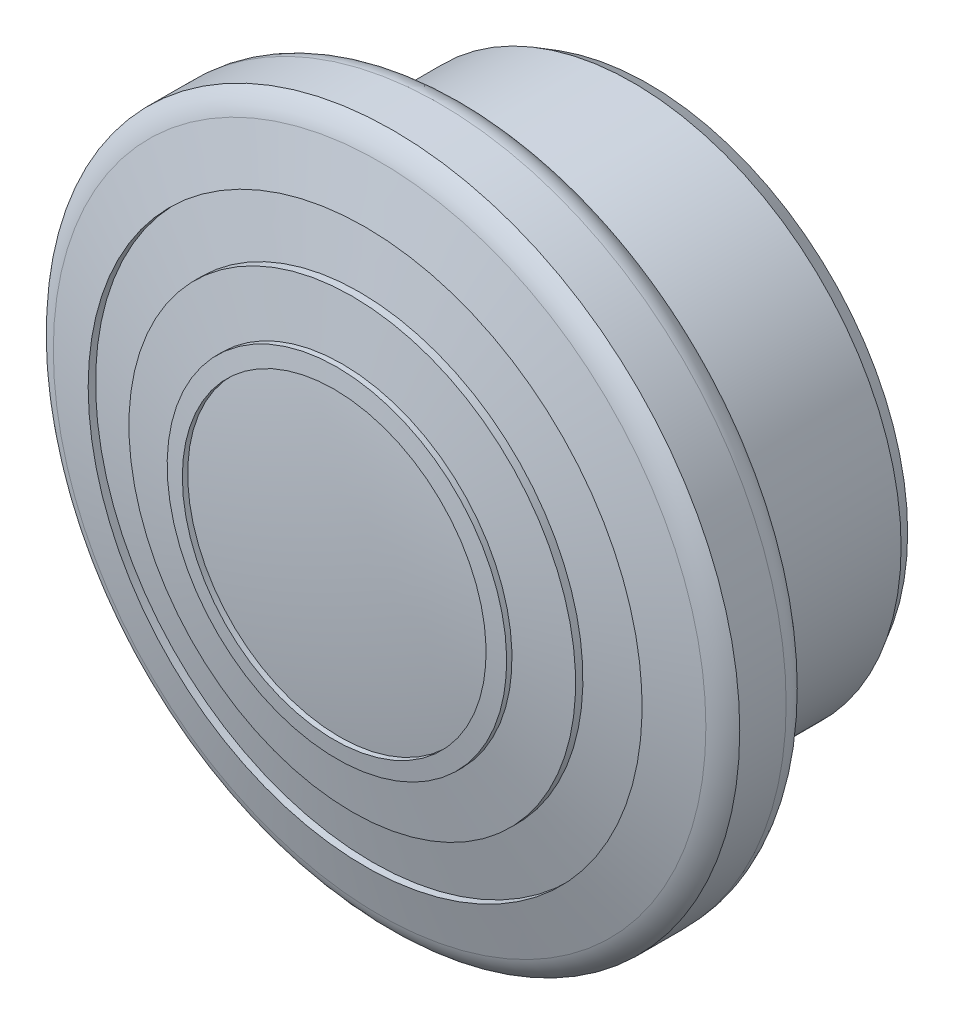
ISO-10303-21;
HEADER;
FILE_DESCRIPTION(('STEP AP214'),'2;1');
FILE_NAME('part.step','',(''),(''),'','','');
FILE_SCHEMA(('AUTOMOTIVE_DESIGN { 1 0 10303 214 1 1 1 1 }'));
ENDSEC;
DATA;
#1=APPLICATION_CONTEXT('core data for automotive mechanical design processes');
#2=APPLICATION_PROTOCOL_DEFINITION('international standard','automotive_design',2000,#1);
#3=PRODUCT_CONTEXT('',#1,'mechanical');
#4=PRODUCT('Part','Part','',(#3));
#5=PRODUCT_RELATED_PRODUCT_CATEGORY('part','',(#4));
#6=PRODUCT_DEFINITION_FORMATION('','',#4);
#7=PRODUCT_DEFINITION_CONTEXT('part definition',#1,'design');
#8=PRODUCT_DEFINITION('design','',#6,#7);
#9=PRODUCT_DEFINITION_SHAPE('','',#8);
#10=(LENGTH_UNIT() NAMED_UNIT(*) SI_UNIT(.MILLI.,.METRE.));
#11=(NAMED_UNIT(*) PLANE_ANGLE_UNIT() SI_UNIT($,.RADIAN.));
#12=(NAMED_UNIT(*) SI_UNIT($,.STERADIAN.) SOLID_ANGLE_UNIT());
#13=UNCERTAINTY_MEASURE_WITH_UNIT(LENGTH_MEASURE(1.E-05),#10,'distance_accuracy_value','');
#14=(GEOMETRIC_REPRESENTATION_CONTEXT(3) GLOBAL_UNCERTAINTY_ASSIGNED_CONTEXT((#13)) GLOBAL_UNIT_ASSIGNED_CONTEXT((#10,
#11,#12)) REPRESENTATION_CONTEXT('',''));
#15=CARTESIAN_POINT('',(0.,0.,0.));
#16=DIRECTION('',(0.,0.,1.));
#17=DIRECTION('',(1.,0.,0.));
#18=AXIS2_PLACEMENT_3D('',#15,#16,#17);
#19=CARTESIAN_POINT('',(-0.0101362856006743,0.,-1.8200000000014));
#20=DIRECTION('',(0.247989742209252,0.657301946897084,0.711656685744111));
#21=DIRECTION('',(-0.965385930744609,0.228955049734044,0.124938344480979));
#22=AXIS2_PLACEMENT_3D('',#19,#20,#21);
#23=SPHERICAL_SURFACE('',#22,60.000000000001);
#24=CARTESIAN_POINT('',(-0.0101362856006742,1.66193269280691E-12,57.5748650979186));
#25=DIRECTION('',(0.,0.,-1.));
#26=DIRECTION('',(0.,1.,0.));
#27=AXIS2_PLACEMENT_3D('',#24,#25,#26);
#28=CIRCLE('',#27,8.5000000000019);
#29=CARTESIAN_POINT('',(-0.0101362856006742,8.50000000000356,57.5748650979186));
#30=VERTEX_POINT('',#29);
#31=EDGE_CURVE('E18',#30,#30,#28,.F.);
#32=ORIENTED_EDGE('',*,*,#31,.T.);
#33=EDGE_LOOP('',(#32));
#34=FACE_BOUND('',#33,.T.);
#35=ADVANCED_FACE('F14',(#34),#23,.T.);
#36=CARTESIAN_POINT('',(-0.0101362856006742,1.66159011743952E-12,51.9799999999986));
#37=DIRECTION('',(0.,0.,-1.));
#38=DIRECTION('',(0.,1.,0.));
#39=AXIS2_PLACEMENT_3D('',#36,#37,#38);
#40=CYLINDRICAL_SURFACE('',#39,8.5000000000019);
#41=ORIENTED_EDGE('',*,*,#31,.F.);
#42=EDGE_LOOP('',(#41));
#43=FACE_BOUND('',#42,.T.);
#44=CARTESIAN_POINT('',(-0.0101362856006742,1.66195101521454E-12,57.8741026051821));
#45=DIRECTION('',(0.,0.,-1.));
#46=DIRECTION('',(-1.,0.,0.));
#47=AXIS2_PLACEMENT_3D('',#44,#45,#46);
#48=CIRCLE('',#47,8.50000000000214);
#49=CARTESIAN_POINT('',(-8.51013628560282,1.66247147291492E-12,57.8741026051821));
#50=VERTEX_POINT('',#49);
#51=EDGE_CURVE('E29',#50,#50,#48,.T.);
#52=ORIENTED_EDGE('',*,*,#51,.F.);
#53=EDGE_LOOP('',(#52));
#54=FACE_BOUND('',#53,.T.);
#55=ADVANCED_FACE('F92',(#43,#54),#40,.F.);
#56=CARTESIAN_POINT('',(-0.0101362856006742,1.66194177191382E-12,57.7231430631412));
#57=DIRECTION('',(0.,0.,-1.));
#58=DIRECTION('',(-1.,0.,0.));
#59=AXIS2_PLACEMENT_3D('',#56,#57,#58);
#60=CONICAL_SURFACE('',#59,9.50000000001828,1.4209680841176);
#61=CARTESIAN_POINT('',(-0.0101362856006742,1.66194177191382E-12,57.7231430631412));
#62=DIRECTION('',(0.,0.,-1.));
#63=DIRECTION('',(0.,1.,0.));
#64=AXIS2_PLACEMENT_3D('',#61,#62,#63);
#65=CIRCLE('',#64,9.50000000001027);
#66=CARTESIAN_POINT('',(-0.0101362856006742,9.50000000001193,57.7231430631412));
#67=VERTEX_POINT('',#66);
#68=EDGE_CURVE('E31',#67,#67,#65,.T.);
#69=ORIENTED_EDGE('',*,*,#68,.F.);
#70=EDGE_LOOP('',(#69));
#71=FACE_BOUND('',#70,.T.);
#72=ORIENTED_EDGE('',*,*,#51,.T.);
#73=EDGE_LOOP('',(#72));
#74=FACE_BOUND('',#73,.T.);
#75=ADVANCED_FACE('F89',(#71,#74),#60,.T.);
#76=CARTESIAN_POINT('',(-0.0101362856006742,1.66159011743952E-12,51.9799999999986));
#77=DIRECTION('',(0.,0.,-1.));
#78=DIRECTION('',(0.,1.,0.));
#79=AXIS2_PLACEMENT_3D('',#76,#77,#78);
#80=CYLINDRICAL_SURFACE('',#79,9.50000000001027);
#81=ORIENTED_EDGE('',*,*,#68,.T.);
#82=EDGE_LOOP('',(#81));
#83=FACE_BOUND('',#82,.T.);
#84=CARTESIAN_POINT('',(-0.0101362856006742,1.66192340281852E-12,57.4231430631423));
#85=DIRECTION('',(0.,0.,-1.));
#86=DIRECTION('',(-1.,0.,0.));
#87=AXIS2_PLACEMENT_3D('',#84,#85,#86);
#88=CIRCLE('',#87,9.50000000000226);
#89=CARTESIAN_POINT('',(-9.51013628560293,1.66250509083658E-12,57.4231430631423));
#90=VERTEX_POINT('',#89);
#91=EDGE_CURVE('E36',#90,#90,#88,.T.);
#92=ORIENTED_EDGE('',*,*,#91,.F.);
#93=EDGE_LOOP('',(#92));
#94=FACE_BOUND('',#93,.T.);
#95=ADVANCED_FACE('F85',(#83,#94),#80,.T.);
#96=CARTESIAN_POINT('',(-0.0101362856006742,1.661889134041E-12,56.8634729715272));
#97=DIRECTION('',(0.,0.,-1.));
#98=DIRECTION('',(-1.,0.,0.));
#99=AXIS2_PLACEMENT_3D('',#96,#97,#98);
#100=CONICAL_SURFACE('',#99,12.5000000000013,1.38635979837077);
#101=CARTESIAN_POINT('',(-0.0101362856006742,1.661889134041E-12,56.8634729715272));
#102=DIRECTION('',(0.,0.,-1.));
#103=DIRECTION('',(0.,1.,0.));
#104=AXIS2_PLACEMENT_3D('',#101,#102,#103);
#105=CIRCLE('',#104,12.5000000000015);
#106=CARTESIAN_POINT('',(-0.0101362856006742,12.5000000000032,56.8634729715272));
#107=VERTEX_POINT('',#106);
#108=EDGE_CURVE('E39',#107,#107,#105,.T.);
#109=ORIENTED_EDGE('',*,*,#108,.F.);
#110=EDGE_LOOP('',(#109));
#111=FACE_BOUND('',#110,.T.);
#112=ORIENTED_EDGE('',*,*,#91,.T.);
#113=EDGE_LOOP('',(#112));
#114=FACE_BOUND('',#113,.T.);
#115=ADVANCED_FACE('F81',(#111,#114),#100,.T.);
#116=CARTESIAN_POINT('',(-0.0101362856006742,1.66159011743952E-12,51.9799999999986));
#117=DIRECTION('',(0.,0.,-1.));
#118=DIRECTION('',(0.,1.,0.));
#119=AXIS2_PLACEMENT_3D('',#116,#117,#118);
#120=CYLINDRICAL_SURFACE('',#119,12.5000000000015);
#121=ORIENTED_EDGE('',*,*,#108,.T.);
#122=EDGE_LOOP('',(#121));
#123=FACE_BOUND('',#122,.T.);
#124=CARTESIAN_POINT('',(-0.0101362856006742,1.66186408863449E-12,56.4544369342186));
#125=DIRECTION('',(0.,0.,-1.));
#126=DIRECTION('',(-1.,0.,0.));
#127=AXIS2_PLACEMENT_3D('',#124,#125,#126);
#128=CIRCLE('',#127,12.5000000000017);
#129=CARTESIAN_POINT('',(-12.5101362856024,1.66262946760563E-12,56.4544369342186));
#130=VERTEX_POINT('',#129);
#131=EDGE_CURVE('E42',#130,#130,#128,.T.);
#132=ORIENTED_EDGE('',*,*,#131,.F.);
#133=EDGE_LOOP('',(#132));
#134=FACE_BOUND('',#133,.T.);
#135=ADVANCED_FACE('F77',(#123,#134),#120,.T.);
#136=CARTESIAN_POINT('',(-0.0101362856006742,1.66181968192284E-12,55.7291963453886));
#137=DIRECTION('',(0.,0.,-1.));
#138=DIRECTION('',(0.,1.,0.));
#139=AXIS2_PLACEMENT_3D('',#136,#137,#138);
#140=CONICAL_SURFACE('',#139,15.5000000000017,1.33360027842022);
#141=CARTESIAN_POINT('',(-0.0101362856006742,1.66181968192284E-12,55.7291963453886));
#142=DIRECTION('',(0.,0.,-1.));
#143=DIRECTION('',(0.,1.,0.));
#144=AXIS2_PLACEMENT_3D('',#141,#142,#143);
#145=CIRCLE('',#144,15.5000000000017);
#146=CARTESIAN_POINT('',(-0.0101362856006742,15.5000000000034,55.7291963453886));
#147=VERTEX_POINT('',#146);
#148=EDGE_CURVE('E45',#147,#147,#145,.F.);
#149=ORIENTED_EDGE('',*,*,#148,.T.);
#150=EDGE_LOOP('',(#149));
#151=FACE_BOUND('',#150,.T.);
#152=ORIENTED_EDGE('',*,*,#131,.T.);
#153=EDGE_LOOP('',(#152));
#154=FACE_BOUND('',#153,.T.);
#155=ADVANCED_FACE('F73',(#151,#154),#140,.T.);
#156=CARTESIAN_POINT('',(-0.0101362856006742,1.66159011743952E-12,51.9799999999986));
#157=DIRECTION('',(0.,0.,-1.));
#158=DIRECTION('',(0.,1.,0.));
#159=AXIS2_PLACEMENT_3D('',#156,#157,#158);
#160=CYLINDRICAL_SURFACE('',#159,15.5000000000017);
#161=ORIENTED_EDGE('',*,*,#148,.F.);
#162=EDGE_LOOP('',(#161));
#163=FACE_BOUND('',#162,.T.);
#164=CARTESIAN_POINT('',(-0.0101362856006742,1.66184504071267E-12,56.1433504897692));
#165=DIRECTION('',(0.,0.,-1.));
#166=DIRECTION('',(-1.,0.,0.));
#167=AXIS2_PLACEMENT_3D('',#164,#165,#166);
#168=CIRCLE('',#167,15.5000000000019);
#169=CARTESIAN_POINT('',(-15.5101362856025,1.66279411063688E-12,56.1433504897692));
#170=VERTEX_POINT('',#169);
#171=EDGE_CURVE('E48',#170,#170,#168,.T.);
#172=ORIENTED_EDGE('',*,*,#171,.F.);
#173=EDGE_LOOP('',(#172));
#174=FACE_BOUND('',#173,.T.);
#175=ADVANCED_FACE('F69',(#163,#174),#160,.F.);
#176=CARTESIAN_POINT('',(-0.0101362856006742,1.66179546395643E-12,55.3336738767881));
#177=DIRECTION('',(0.,0.,-1.));
#178=DIRECTION('',(-1.,0.,0.));
#179=AXIS2_PLACEMENT_3D('',#176,#177,#178);
#180=CONICAL_SURFACE('',#179,18.2608745821969,1.28552691606649);
#181=CARTESIAN_POINT('',(-0.0101362856006742,1.66230705472605E-12,55.3336738767881));
#182=DIRECTION('',(0.,0.,1.));
#183=DIRECTION('',(1.,0.,0.));
#184=AXIS2_PLACEMENT_3D('',#181,#182,#183);
#185=CIRCLE('',#184,18.2608745821969);
#186=CARTESIAN_POINT('',(18.2507382965962,1.66118893557406E-12,55.3336738767881));
#187=VERTEX_POINT('',#186);
#188=EDGE_CURVE('E51',#187,#187,#185,.F.);
#189=ORIENTED_EDGE('',*,*,#188,.F.);
#190=EDGE_LOOP('',(#189));
#191=FACE_BOUND('',#190,.T.);
#192=ORIENTED_EDGE('',*,*,#171,.T.);
#193=EDGE_LOOP('',(#192));
#194=FACE_BOUND('',#193,.T.);
#195=ADVANCED_FACE('F64',(#191,#194),#180,.T.);
#196=CARTESIAN_POINT('',(-0.0101362856006742,1.66216123973762E-12,52.9522557505186));
#197=DIRECTION('',(0.,0.,1.));
#198=DIRECTION('',(1.,0.,0.));
#199=AXIS2_PLACEMENT_3D('',#196,#197,#198);
#200=TOROIDAL_SURFACE('',#199,17.5000000000017,2.50001648433679);
#201=CARTESIAN_POINT('',(-0.0101362856006742,1.6617491380115E-12,54.5770887948514));
#202=DIRECTION('',(0.,0.,-1.));
#203=DIRECTION('',(0.,1.,0.));
#204=AXIS2_PLACEMENT_3D('',#201,#202,#203);
#205=CIRCLE('',#204,19.4000000000017);
#206=CARTESIAN_POINT('',(-0.0101362856006742,19.4000000000034,54.5770887948514));
#207=VERTEX_POINT('',#206);
#208=EDGE_CURVE('E54',#207,#207,#205,.T.);
#209=ORIENTED_EDGE('',*,*,#208,.F.);
#210=EDGE_LOOP('',(#209));
#211=FACE_BOUND('',#210,.T.);
#212=ORIENTED_EDGE('',*,*,#188,.T.);
#213=EDGE_LOOP('',(#212));
#214=FACE_BOUND('',#213,.T.);
#215=ADVANCED_FACE('F59',(#211,#214),#200,.T.);
#216=CARTESIAN_POINT('',(-0.0101362856006742,1.66159011743952E-12,51.9799999999986));
#217=DIRECTION('',(0.,0.,-1.));
#218=DIRECTION('',(0.,1.,0.));
#219=AXIS2_PLACEMENT_3D('',#216,#217,#218);
#220=CYLINDRICAL_SURFACE('',#219,19.4000000000017);
#221=ORIENTED_EDGE('',*,*,#208,.T.);
#222=EDGE_LOOP('',(#221));
#223=FACE_BOUND('',#222,.T.);
#224=CARTESIAN_POINT('',(-0.0101362856006742,1.66210170820914E-12,51.9799999999986));
#225=DIRECTION('',(0.,0.,1.));
#226=DIRECTION('',(1.,0.,0.));
#227=AXIS2_PLACEMENT_3D('',#224,#225,#226);
#228=CIRCLE('',#227,19.4000000000017);
#229=CARTESIAN_POINT('',(19.389863714401,1.66091384004593E-12,51.9799999999986));
#230=VERTEX_POINT('',#229);
#231=EDGE_CURVE('E133',#230,#230,#228,.F.);
#232=ORIENTED_EDGE('',*,*,#231,.F.);
#233=EDGE_LOOP('',(#232));
#234=FACE_BOUND('',#233,.T.);
#235=ADVANCED_FACE('F63',(#223,#234),#220,.T.);
#236=CARTESIAN_POINT('',(-0.0101362856006742,1.66210170820914E-12,51.9799999999986));
#237=DIRECTION('',(0.,0.,1.));
#238=DIRECTION('',(1.,0.,0.));
#239=AXIS2_PLACEMENT_3D('',#236,#237,#238);
#240=TOROIDAL_SURFACE('',#239,17.9000000000017,1.5);
#241=CARTESIAN_POINT('',(-0.0101362856006742,1.66149862146275E-12,50.4857079528597));
#242=DIRECTION('',(0.,0.,1.));
#243=DIRECTION('',(1.,0.,0.));
#244=AXIS2_PLACEMENT_3D('',#241,#242,#243);
#245=CIRCLE('',#244,18.0307336141087);
#246=CARTESIAN_POINT('',(18.020597328508,1.66039459391536E-12,50.4857079528597));
#247=VERTEX_POINT('',#246);
#248=EDGE_CURVE('E135',#247,#247,#245,.F.);
#249=ORIENTED_EDGE('',*,*,#248,.F.);
#250=EDGE_LOOP('',(#249));
#251=FACE_BOUND('',#250,.T.);
#252=ORIENTED_EDGE('',*,*,#231,.T.);
#253=EDGE_LOOP('',(#252));
#254=FACE_BOUND('',#253,.T.);
#255=ADVANCED_FACE('F123',(#251,#254),#240,.T.);
#256=CARTESIAN_POINT('',(-0.0101362856006742,1.66149862146275E-12,50.4857079528597));
#257=DIRECTION('',(0.,0.,1.));
#258=DIRECTION('',(1.,0.,0.));
#259=AXIS2_PLACEMENT_3D('',#256,#257,#258);
#260=CONICAL_SURFACE('',#259,18.0307336141087,1.48352986419544);
#261=CARTESIAN_POINT('',(-0.0101362856006742,1.66148483098254E-12,50.2604848814986));
#262=DIRECTION('',(0.,0.,1.));
#263=DIRECTION('',(1.,0.,0.));
#264=AXIS2_PLACEMENT_3D('',#261,#262,#263);
#265=CIRCLE('',#264,15.456422128655);
#266=CARTESIAN_POINT('',(15.4462858430543,1.66053842934524E-12,50.2604848814986));
#267=VERTEX_POINT('',#266);
#268=EDGE_CURVE('E131',#267,#267,#265,.F.);
#269=ORIENTED_EDGE('',*,*,#268,.F.);
#270=EDGE_LOOP('',(#269));
#271=FACE_BOUND('',#270,.T.);
#272=ORIENTED_EDGE('',*,*,#248,.T.);
#273=EDGE_LOOP('',(#272));
#274=FACE_BOUND('',#273,.T.);
#275=ADVANCED_FACE('F120',(#271,#274),#260,.T.);
#276=CARTESIAN_POINT('',(-0.0101362856006742,1.66148483098254E-12,50.2604848814986));
#277=DIRECTION('',(0.,0.,1.));
#278=DIRECTION('',(0.,-1.,0.));
#279=AXIS2_PLACEMENT_3D('',#276,#277,#278);
#280=CONICAL_SURFACE('',#279,15.456422128655,0.741764932123086);
#281=CARTESIAN_POINT('',(-0.0101362856006742,1.66145433232362E-12,49.7623875324486));
#282=DIRECTION('',(0.,0.,-1.));
#283=DIRECTION('',(0.,1.,0.));
#284=AXIS2_PLACEMENT_3D('',#281,#282,#283);
#285=CIRCLE('',#284,15.0000000000016);
#286=CARTESIAN_POINT('',(-0.0101362856006742,15.0000000000033,49.7623875324486));
#287=VERTEX_POINT('',#286);
#288=EDGE_CURVE('E26',#287,#287,#285,.T.);
#289=ORIENTED_EDGE('',*,*,#288,.F.);
#290=EDGE_LOOP('',(#289));
#291=FACE_BOUND('',#290,.T.);
#292=ORIENTED_EDGE('',*,*,#268,.T.);
#293=EDGE_LOOP('',(#292));
#294=FACE_BOUND('',#293,.T.);
#295=ADVANCED_FACE('F116',(#291,#294),#280,.T.);
#296=CARTESIAN_POINT('',(-0.0101362856006742,1.66159011743952E-12,51.9799999999986));
#297=DIRECTION('',(0.,0.,-1.));
#298=DIRECTION('',(0.,1.,0.));
#299=AXIS2_PLACEMENT_3D('',#296,#297,#298);
#300=CYLINDRICAL_SURFACE('',#299,15.0000000000016);
#301=CARTESIAN_POINT('',(-0.0101362856006742,1.66092674973314E-12,41.1460254037827));
#302=DIRECTION('',(0.,0.,1.));
#303=DIRECTION('',(1.,0.,0.));
#304=AXIS2_PLACEMENT_3D('',#301,#302,#303);
#305=CIRCLE('',#304,15.0000000000016);
#306=CARTESIAN_POINT('',(14.9898637144009,1.66000829496777E-12,41.1460254037827));
#307=VERTEX_POINT('',#306);
#308=EDGE_CURVE('E22',#307,#307,#305,.F.);
#309=ORIENTED_EDGE('',*,*,#308,.F.);
#310=EDGE_LOOP('',(#309));
#311=FACE_BOUND('',#310,.T.);
#312=ORIENTED_EDGE('',*,*,#288,.T.);
#313=EDGE_LOOP('',(#312));
#314=FACE_BOUND('',#313,.T.);
#315=ADVANCED_FACE('F111',(#311,#314),#300,.T.);
#316=CARTESIAN_POINT('',(-0.0101362856006742,1.66092674973314E-12,41.1460254037827));
#317=DIRECTION('',(0.,0.,1.));
#318=DIRECTION('',(1.,0.,0.));
#319=AXIS2_PLACEMENT_3D('',#316,#317,#318);
#320=CONICAL_SURFACE('',#319,15.0000000000016,0.523598775598298);
#321=CARTESIAN_POINT('',(-0.0101362856006742,1.66092674973314E-12,40.2799999999986));
#322=DIRECTION('',(0.,0.,1.));
#323=DIRECTION('',(1.,0.,0.));
#324=AXIS2_PLACEMENT_3D('',#321,#322,#323);
#325=CIRCLE('',#324,14.5000000000018);
#326=CARTESIAN_POINT('',(14.4898637144011,1.66092674973314E-12,40.2799999999986));
#327=VERTEX_POINT('',#326);
#328=EDGE_CURVE('E10',#327,#327,#325,.T.);
#329=ORIENTED_EDGE('',*,*,#328,.T.);
#330=EDGE_LOOP('',(#329));
#331=FACE_BOUND('',#330,.T.);
#332=ORIENTED_EDGE('',*,*,#308,.T.);
#333=EDGE_LOOP('',(#332));
#334=FACE_BOUND('',#333,.T.);
#335=ADVANCED_FACE('F105',(#331,#334),#320,.T.);
#336=CARTESIAN_POINT('',(-0.0101362856006743,1.66087372272254E-12,40.2799999999986));
#337=DIRECTION('',(0.,0.,1.));
#338=DIRECTION('',(0.,-1.,0.));
#339=AXIS2_PLACEMENT_3D('',#336,#337,#338);
#340=PLANE('',#339);
#341=ORIENTED_EDGE('',*,*,#328,.F.);
#342=EDGE_LOOP('',(#341));
#343=FACE_BOUND('',#342,.T.);
#344=ADVANCED_FACE('F103',(#343),#340,.F.);
#345=CLOSED_SHELL('',(#35,#55,#75,#95,#115,#135,#155,#175,#195,#215,#235,#255,#275,#295,#315,
#335,#344));
#346=MANIFOLD_SOLID_BREP('B1',#345);
#347=ADVANCED_BREP_SHAPE_REPRESENTATION('',(#18,#346),#14);
#348=SHAPE_DEFINITION_REPRESENTATION(#9,#347);
ENDSEC;
END-ISO-10303-21;
